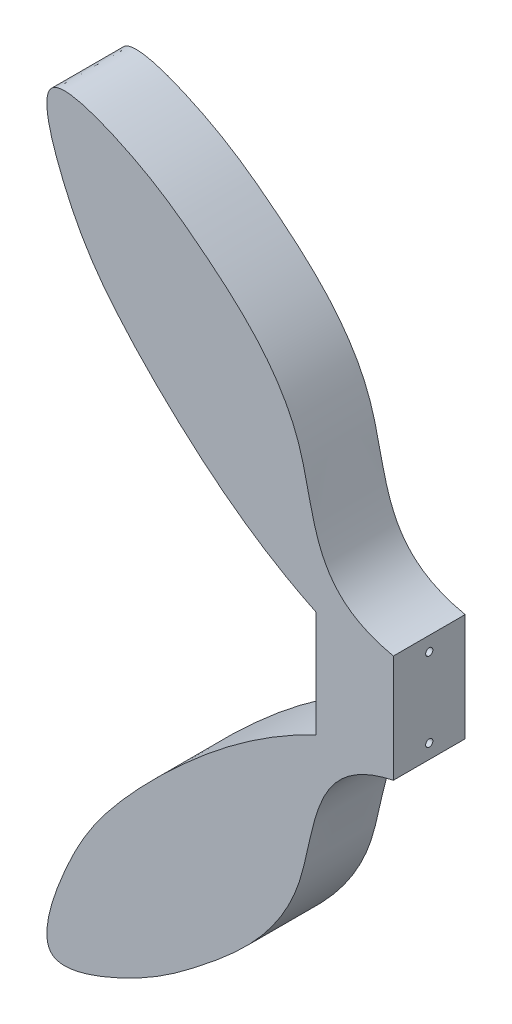
ISO-10303-21;
HEADER;
FILE_DESCRIPTION(('STEP AP214'),'2;1');
FILE_NAME('part.step','',(''),(''),'','','');
FILE_SCHEMA(('AUTOMOTIVE_DESIGN { 1 0 10303 214 1 1 1 1 }'));
ENDSEC;
DATA;
#1=APPLICATION_CONTEXT('core data for automotive mechanical design processes');
#2=APPLICATION_PROTOCOL_DEFINITION('international standard','automotive_design',2000,#1);
#3=PRODUCT_CONTEXT('',#1,'mechanical');
#4=PRODUCT('Part','Part','',(#3));
#5=PRODUCT_RELATED_PRODUCT_CATEGORY('part','',(#4));
#6=PRODUCT_DEFINITION_FORMATION('','',#4);
#7=PRODUCT_DEFINITION_CONTEXT('part definition',#1,'design');
#8=PRODUCT_DEFINITION('design','',#6,#7);
#9=PRODUCT_DEFINITION_SHAPE('','',#8);
#10=(LENGTH_UNIT() NAMED_UNIT(*) SI_UNIT(.MILLI.,.METRE.));
#11=(NAMED_UNIT(*) PLANE_ANGLE_UNIT() SI_UNIT($,.RADIAN.));
#12=(NAMED_UNIT(*) SI_UNIT($,.STERADIAN.) SOLID_ANGLE_UNIT());
#13=UNCERTAINTY_MEASURE_WITH_UNIT(LENGTH_MEASURE(1.E-05),#10,'distance_accuracy_value','');
#14=(GEOMETRIC_REPRESENTATION_CONTEXT(3) GLOBAL_UNCERTAINTY_ASSIGNED_CONTEXT((#13)) GLOBAL_UNIT_ASSIGNED_CONTEXT((#10,
#11,#12)) REPRESENTATION_CONTEXT('',''));
#15=CARTESIAN_POINT('',(0.,0.,0.));
#16=DIRECTION('',(0.,0.,1.));
#17=DIRECTION('',(1.,0.,0.));
#18=AXIS2_PLACEMENT_3D('',#15,#16,#17);
#19=CARTESIAN_POINT('',(15.4866245090492,15.,10.));
#20=CARTESIAN_POINT('',(-8.2714934927004,20.026301379398,10.));
#21=CARTESIAN_POINT('',(-4.7174506350427,45.5527021533342,10.));
#22=CARTESIAN_POINT('',(-20.8581252587843,72.3408259402043,10.));
#23=CARTESIAN_POINT('',(-39.4550777122463,87.9535408153759,10.));
#24=CARTESIAN_POINT('',(-55.8517255506388,99.6808621985862,10.));
#25=CARTESIAN_POINT('',(-86.0284552410956,110.848384128478,10.));
#26=CARTESIAN_POINT('',(-75.5822949112437,78.2656237098901,10.));
#27=CARTESIAN_POINT('',(-63.5553036226875,60.4904379702806,10.));
#28=CARTESIAN_POINT('',(-39.2680399429495,35.6798469101435,10.));
#29=CARTESIAN_POINT('',(-20.3237326629356,21.6467425789033,10.));
#30=CARTESIAN_POINT('',(-6.06150401625882,14.8109019515985,10.));
#31=B_SPLINE_CURVE_WITH_KNOTS('',3,(#19,#20,#21,#22,#23,#24,#25,#26,#27,#28,#29,#30),
.UNSPECIFIED.,.F.,.F.,(4,1,1,1,1,1,1,1,1,4),(0.,0.186870654388039,0.261406402786041,
0.356660645205834,0.456593384180105,0.531301119996209,0.612808006799875,0.720982892822761,
0.820295590345475,1.),.UNSPECIFIED.);
#32=DIRECTION('',(0.,0.,-1.));
#33=VECTOR('',#32,1.);
#34=SURFACE_OF_LINEAR_EXTRUSION('',#31,#33);
#35=CARTESIAN_POINT('',(15.4866245090492,15.,-10.));
#36=CARTESIAN_POINT('',(-8.2714934927004,20.026301379398,-10.));
#37=CARTESIAN_POINT('',(-4.7174506350427,45.5527021533342,-10.));
#38=CARTESIAN_POINT('',(-20.8581252587843,72.3408259402043,-10.));
#39=CARTESIAN_POINT('',(-39.4550777122463,87.9535408153759,-10.));
#40=CARTESIAN_POINT('',(-55.8517255506388,99.6808621985862,-10.));
#41=CARTESIAN_POINT('',(-86.0284552410956,110.848384128478,-10.));
#42=CARTESIAN_POINT('',(-75.5822949112437,78.2656237098901,-10.));
#43=CARTESIAN_POINT('',(-63.5553036226875,60.4904379702806,-10.));
#44=CARTESIAN_POINT('',(-39.2680399429495,35.6798469101435,-10.));
#45=CARTESIAN_POINT('',(-20.3237326629356,21.6467425789033,-10.));
#46=CARTESIAN_POINT('',(-6.06150401625882,14.8109019515985,-10.));
#47=B_SPLINE_CURVE_WITH_KNOTS('',3,(#35,#36,#37,#38,#39,#40,#41,#42,#43,#44,#45,#46),
.UNSPECIFIED.,.F.,.F.,(4,1,1,1,1,1,1,1,1,4),(0.,0.186870654388039,0.261406402786041,
0.356660645205834,0.456593384180105,0.531301119996209,0.612808006799875,0.720982892822761,
0.820295590345475,1.),.UNSPECIFIED.);
#48=CARTESIAN_POINT('',(15.4866245090492,15.,-10.));
#49=VERTEX_POINT('',#48);
#50=CARTESIAN_POINT('',(-6.06150401625882,14.8109019515985,-10.));
#51=VERTEX_POINT('',#50);
#52=EDGE_CURVE('E122',#49,#51,#47,.T.);
#53=ORIENTED_EDGE('',*,*,#52,.T.);
#54=DIRECTION('',(0.,0.,-1.));
#55=VECTOR('',#54,1.);
#56=CARTESIAN_POINT('',(-6.06150401625882,14.8109019515985,10.));
#57=LINE('',#56,#55);
#58=CARTESIAN_POINT('',(-6.06150401625882,14.8109019515985,10.));
#59=VERTEX_POINT('',#58);
#60=EDGE_CURVE('E11',#59,#51,#57,.T.);
#61=ORIENTED_EDGE('',*,*,#60,.F.);
#62=CARTESIAN_POINT('',(15.4866245090492,15.,10.));
#63=VERTEX_POINT('',#62);
#64=EDGE_CURVE('E91',#63,#59,#31,.T.);
#65=ORIENTED_EDGE('',*,*,#64,.F.);
#66=DIRECTION('',(0.,0.,-1.));
#67=VECTOR('',#66,1.);
#68=CARTESIAN_POINT('',(15.4866245090492,15.,10.));
#69=LINE('',#68,#67);
#70=EDGE_CURVE('E99',#63,#49,#69,.T.);
#71=ORIENTED_EDGE('',*,*,#70,.T.);
#72=EDGE_LOOP('',(#53,#61,#65,#71));
#73=FACE_BOUND('',#72,.T.);
#74=ADVANCED_FACE('F39',(#73),#34,.F.);
#75=CARTESIAN_POINT('',(-6.06150401625882,-14.8109019515985,10.));
#76=DIRECTION('',(1.,0.,0.));
#77=DIRECTION('',(0.,0.,-1.));
#78=AXIS2_PLACEMENT_3D('',#75,#76,#77);
#79=PLANE('',#78);
#80=DIRECTION('',(0.,-1.,0.));
#81=VECTOR('',#80,1.);
#82=CARTESIAN_POINT('',(-6.06150401625882,-14.8109019515985,-10.));
#83=LINE('',#82,#81);
#84=CARTESIAN_POINT('',(-6.06150401625882,-14.8109019515985,-10.));
#85=VERTEX_POINT('',#84);
#86=EDGE_CURVE('E95',#51,#85,#83,.T.);
#87=ORIENTED_EDGE('',*,*,#86,.T.);
#88=DIRECTION('',(0.,0.,-1.));
#89=VECTOR('',#88,1.);
#90=CARTESIAN_POINT('',(-6.06150401625882,-14.8109019515985,10.));
#91=LINE('',#90,#89);
#92=CARTESIAN_POINT('',(-6.06150401625882,-14.8109019515985,10.));
#93=VERTEX_POINT('',#92);
#94=EDGE_CURVE('E48',#93,#85,#91,.T.);
#95=ORIENTED_EDGE('',*,*,#94,.F.);
#96=DIRECTION('',(0.,-1.,0.));
#97=VECTOR('',#96,1.);
#98=CARTESIAN_POINT('',(-6.06150401625882,-14.8109019515985,10.));
#99=LINE('',#98,#97);
#100=EDGE_CURVE('E86',#59,#93,#99,.T.);
#101=ORIENTED_EDGE('',*,*,#100,.F.);
#102=ORIENTED_EDGE('',*,*,#60,.T.);
#103=EDGE_LOOP('',(#87,#95,#101,#102));
#104=FACE_BOUND('',#103,.T.);
#105=ADVANCED_FACE('F94',(#104),#79,.F.);
#106=CARTESIAN_POINT('',(-6.06150401625882,-14.8109019515985,10.));
#107=CARTESIAN_POINT('',(-20.3237326629356,-21.6467425789033,10.));
#108=CARTESIAN_POINT('',(-39.2680399429495,-35.6798469101435,10.));
#109=CARTESIAN_POINT('',(-63.5553036226875,-60.4904379702806,10.));
#110=CARTESIAN_POINT('',(-75.5822949112437,-78.2656237098901,10.));
#111=CARTESIAN_POINT('',(-86.0284552410956,-110.848384128478,10.));
#112=CARTESIAN_POINT('',(-55.8517255506388,-99.6808621985862,10.));
#113=CARTESIAN_POINT('',(-39.4550777122463,-87.9535408153759,10.));
#114=CARTESIAN_POINT('',(-20.8581252587843,-72.3408259402044,10.));
#115=CARTESIAN_POINT('',(-4.7174506350427,-45.5527021533342,10.));
#116=CARTESIAN_POINT('',(-8.2714934927004,-20.026301379398,10.));
#117=CARTESIAN_POINT('',(15.4866245090492,-15.,10.));
#118=B_SPLINE_CURVE_WITH_KNOTS('',3,(#106,#107,#108,#109,#110,#111,#112,#113,#114,#115,#116,
#117),.UNSPECIFIED.,.F.,.F.,(4,1,1,1,1,1,1,1,1,4),(0.,0.179704409654525,0.279017107177239,
0.387191993200125,0.468698880003791,0.543406615819895,0.643339354794166,0.738593597213959,
0.813129345611961,1.),.UNSPECIFIED.);
#119=DIRECTION('',(0.,0.,-1.));
#120=VECTOR('',#119,1.);
#121=SURFACE_OF_LINEAR_EXTRUSION('',#118,#120);
#122=CARTESIAN_POINT('',(-6.06150401625882,-14.8109019515985,-10.));
#123=CARTESIAN_POINT('',(-20.3237326629356,-21.6467425789033,-10.));
#124=CARTESIAN_POINT('',(-39.2680399429495,-35.6798469101435,-10.));
#125=CARTESIAN_POINT('',(-63.5553036226875,-60.4904379702806,-10.));
#126=CARTESIAN_POINT('',(-75.5822949112437,-78.2656237098901,-10.));
#127=CARTESIAN_POINT('',(-86.0284552410956,-110.848384128478,-10.));
#128=CARTESIAN_POINT('',(-55.8517255506388,-99.6808621985862,-10.));
#129=CARTESIAN_POINT('',(-39.4550777122463,-87.9535408153759,-10.));
#130=CARTESIAN_POINT('',(-20.8581252587843,-72.3408259402044,-10.));
#131=CARTESIAN_POINT('',(-4.7174506350427,-45.5527021533342,-10.));
#132=CARTESIAN_POINT('',(-8.2714934927004,-20.026301379398,-10.));
#133=CARTESIAN_POINT('',(15.4866245090492,-15.,-10.));
#134=B_SPLINE_CURVE_WITH_KNOTS('',3,(#122,#123,#124,#125,#126,#127,#128,#129,#130,#131,#132,
#133),.UNSPECIFIED.,.F.,.F.,(4,1,1,1,1,1,1,1,1,4),(0.,0.179704409654525,0.279017107177239,
0.387191993200125,0.468698880003791,0.543406615819895,0.643339354794166,0.738593597213959,
0.813129345611961,1.),.UNSPECIFIED.);
#135=CARTESIAN_POINT('',(15.4866245090492,-15.,-10.));
#136=VERTEX_POINT('',#135);
#137=EDGE_CURVE('E73',#85,#136,#134,.T.);
#138=ORIENTED_EDGE('',*,*,#137,.T.);
#139=DIRECTION('',(0.,0.,-1.));
#140=VECTOR('',#139,1.);
#141=CARTESIAN_POINT('',(15.4866245090492,-15.,10.));
#142=LINE('',#141,#140);
#143=CARTESIAN_POINT('',(15.4866245090492,-15.,10.));
#144=VERTEX_POINT('',#143);
#145=EDGE_CURVE('E96',#144,#136,#142,.T.);
#146=ORIENTED_EDGE('',*,*,#145,.F.);
#147=EDGE_CURVE('E89',#93,#144,#118,.T.);
#148=ORIENTED_EDGE('',*,*,#147,.F.);
#149=ORIENTED_EDGE('',*,*,#94,.T.);
#150=EDGE_LOOP('',(#138,#146,#148,#149));
#151=FACE_BOUND('',#150,.T.);
#152=ADVANCED_FACE('F97',(#151),#121,.F.);
#153=CARTESIAN_POINT('',(15.4866245090492,15.,10.));
#154=DIRECTION('',(-1.,0.,0.));
#155=DIRECTION('',(0.,0.,1.));
#156=AXIS2_PLACEMENT_3D('',#153,#154,#155);
#157=PLANE('',#156);
#158=CARTESIAN_POINT('',(15.4866245090492,-11.,0.));
#159=DIRECTION('',(1.,0.,0.));
#160=DIRECTION('',(0.,0.,1.));
#161=AXIS2_PLACEMENT_3D('',#158,#159,#160);
#162=CIRCLE('',#161,1.);
#163=CARTESIAN_POINT('',(15.4866245090492,-11.,1.));
#164=VERTEX_POINT('',#163);
#165=EDGE_CURVE('E170',#164,#164,#162,.T.);
#166=ORIENTED_EDGE('',*,*,#165,.F.);
#167=EDGE_LOOP('',(#166));
#168=FACE_BOUND('',#167,.T.);
#169=CARTESIAN_POINT('',(15.4866245090492,11.,0.));
#170=DIRECTION('',(1.,0.,0.));
#171=DIRECTION('',(0.,0.,-1.));
#172=AXIS2_PLACEMENT_3D('',#169,#170,#171);
#173=CIRCLE('',#172,1.);
#174=CARTESIAN_POINT('',(15.4866245090492,11.,-1.));
#175=VERTEX_POINT('',#174);
#176=EDGE_CURVE('E127',#175,#175,#173,.T.);
#177=ORIENTED_EDGE('',*,*,#176,.F.);
#178=EDGE_LOOP('',(#177));
#179=FACE_BOUND('',#178,.T.);
#180=DIRECTION('',(0.,1.,0.));
#181=VECTOR('',#180,1.);
#182=CARTESIAN_POINT('',(15.4866245090492,15.,-10.));
#183=LINE('',#182,#181);
#184=EDGE_CURVE('E79',#136,#49,#183,.T.);
#185=ORIENTED_EDGE('',*,*,#184,.T.);
#186=ORIENTED_EDGE('',*,*,#70,.F.);
#187=DIRECTION('',(0.,1.,0.));
#188=VECTOR('',#187,1.);
#189=CARTESIAN_POINT('',(15.4866245090492,15.,10.));
#190=LINE('',#189,#188);
#191=EDGE_CURVE('E56',#144,#63,#190,.T.);
#192=ORIENTED_EDGE('',*,*,#191,.F.);
#193=ORIENTED_EDGE('',*,*,#145,.T.);
#194=EDGE_LOOP('',(#185,#186,#192,#193));
#195=FACE_BOUND('',#194,.T.);
#196=ADVANCED_FACE('F111',(#168,#179,#195),#157,.F.);
#197=CARTESIAN_POINT('',(-73.1963386721219,105.289148477606,10.));
#198=DIRECTION('',(0.,0.,1.));
#199=DIRECTION('',(1.,0.,0.));
#200=AXIS2_PLACEMENT_3D('',#197,#198,#199);
#201=PLANE('',#200);
#202=ORIENTED_EDGE('',*,*,#64,.T.);
#203=ORIENTED_EDGE('',*,*,#100,.T.);
#204=ORIENTED_EDGE('',*,*,#147,.T.);
#205=ORIENTED_EDGE('',*,*,#191,.T.);
#206=EDGE_LOOP('',(#202,#203,#204,#205));
#207=FACE_BOUND('',#206,.T.);
#208=ADVANCED_FACE('F87',(#207),#201,.T.);
#209=CARTESIAN_POINT('',(-73.1963386721219,105.289148477606,-10.));
#210=DIRECTION('',(0.,0.,1.));
#211=DIRECTION('',(1.,0.,0.));
#212=AXIS2_PLACEMENT_3D('',#209,#210,#211);
#213=PLANE('',#212);
#214=ORIENTED_EDGE('',*,*,#52,.F.);
#215=ORIENTED_EDGE('',*,*,#184,.F.);
#216=ORIENTED_EDGE('',*,*,#137,.F.);
#217=ORIENTED_EDGE('',*,*,#86,.F.);
#218=EDGE_LOOP('',(#214,#215,#216,#217));
#219=FACE_BOUND('',#218,.T.);
#220=ADVANCED_FACE('F143',(#219),#213,.F.);
#221=CARTESIAN_POINT('',(5.48662450904924,11.,0.));
#222=DIRECTION('',(1.,0.,0.));
#223=DIRECTION('',(0.,0.,-1.));
#224=AXIS2_PLACEMENT_3D('',#221,#222,#223);
#225=CYLINDRICAL_SURFACE('',#224,1.);
#226=CARTESIAN_POINT('',(5.48662450904924,11.,0.));
#227=DIRECTION('',(1.,0.,0.));
#228=DIRECTION('',(0.,0.,-1.));
#229=AXIS2_PLACEMENT_3D('',#226,#227,#228);
#230=CIRCLE('',#229,1.);
#231=CARTESIAN_POINT('',(5.48662450904924,11.,-1.));
#232=VERTEX_POINT('',#231);
#233=EDGE_CURVE('E124',#232,#232,#230,.T.);
#234=ORIENTED_EDGE('',*,*,#233,.F.);
#235=EDGE_LOOP('',(#234));
#236=FACE_BOUND('',#235,.T.);
#237=ORIENTED_EDGE('',*,*,#176,.T.);
#238=EDGE_LOOP('',(#237));
#239=FACE_BOUND('',#238,.T.);
#240=ADVANCED_FACE('F145',(#236,#239),#225,.F.);
#241=CARTESIAN_POINT('',(5.48662450904924,11.,0.));
#242=DIRECTION('',(1.,0.,0.));
#243=DIRECTION('',(0.,0.,-1.));
#244=AXIS2_PLACEMENT_3D('',#241,#242,#243);
#245=PLANE('',#244);
#246=ORIENTED_EDGE('',*,*,#233,.T.);
#247=EDGE_LOOP('',(#246));
#248=FACE_BOUND('',#247,.T.);
#249=ADVANCED_FACE('F150',(#248),#245,.T.);
#250=CARTESIAN_POINT('',(5.48662450904924,-11.,0.));
#251=DIRECTION('',(1.,0.,0.));
#252=DIRECTION('',(0.,0.,-1.));
#253=AXIS2_PLACEMENT_3D('',#250,#251,#252);
#254=CYLINDRICAL_SURFACE('',#253,1.);
#255=CARTESIAN_POINT('',(5.48662450904924,-11.,0.));
#256=DIRECTION('',(1.,0.,0.));
#257=DIRECTION('',(0.,0.,1.));
#258=AXIS2_PLACEMENT_3D('',#255,#256,#257);
#259=CIRCLE('',#258,1.);
#260=CARTESIAN_POINT('',(5.48662450904924,-11.,1.));
#261=VERTEX_POINT('',#260);
#262=EDGE_CURVE('E169',#261,#261,#259,.T.);
#263=ORIENTED_EDGE('',*,*,#262,.F.);
#264=EDGE_LOOP('',(#263));
#265=FACE_BOUND('',#264,.T.);
#266=ORIENTED_EDGE('',*,*,#165,.T.);
#267=EDGE_LOOP('',(#266));
#268=FACE_BOUND('',#267,.T.);
#269=ADVANCED_FACE('F157',(#265,#268),#254,.F.);
#270=CARTESIAN_POINT('',(5.48662450904924,-11.,0.));
#271=DIRECTION('',(-1.,0.,0.));
#272=DIRECTION('',(0.,0.,1.));
#273=AXIS2_PLACEMENT_3D('',#270,#271,#272);
#274=PLANE('',#273);
#275=ORIENTED_EDGE('',*,*,#262,.T.);
#276=EDGE_LOOP('',(#275));
#277=FACE_BOUND('',#276,.T.);
#278=ADVANCED_FACE('F161',(#277),#274,.F.);
#279=CLOSED_SHELL('',(#74,#105,#152,#196,#208,#220,#240,#249,#269,#278));
#280=MANIFOLD_SOLID_BREP('B2',#279);
#281=ADVANCED_BREP_SHAPE_REPRESENTATION('',(#18,#280),#14);
#282=SHAPE_DEFINITION_REPRESENTATION(#9,#281);
ENDSEC;
END-ISO-10303-21;
